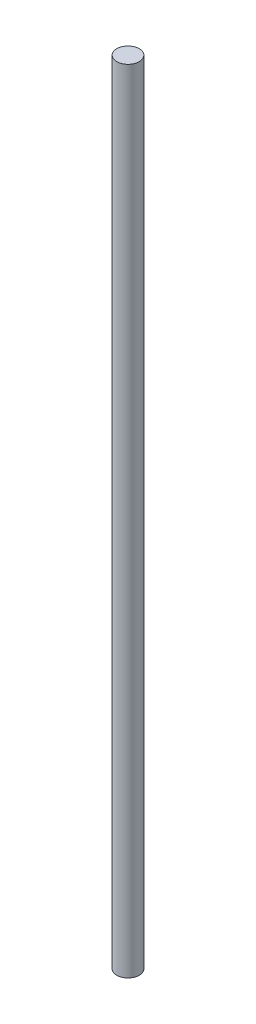
ISO-10303-21;
HEADER;
FILE_DESCRIPTION(('STEP AP214'),'2;1');
FILE_NAME('part.step','',(''),(''),'','','');
FILE_SCHEMA(('AUTOMOTIVE_DESIGN { 1 0 10303 214 1 1 1 1 }'));
ENDSEC;
DATA;
#1=APPLICATION_CONTEXT('core data for automotive mechanical design processes');
#2=APPLICATION_PROTOCOL_DEFINITION('international standard','automotive_design',2000,#1);
#3=PRODUCT_CONTEXT('',#1,'mechanical');
#4=PRODUCT('Part','Part','',(#3));
#5=PRODUCT_RELATED_PRODUCT_CATEGORY('part','',(#4));
#6=PRODUCT_DEFINITION_FORMATION('','',#4);
#7=PRODUCT_DEFINITION_CONTEXT('part definition',#1,'design');
#8=PRODUCT_DEFINITION('design','',#6,#7);
#9=PRODUCT_DEFINITION_SHAPE('','',#8);
#10=(LENGTH_UNIT() NAMED_UNIT(*) SI_UNIT(.MILLI.,.METRE.));
#11=(NAMED_UNIT(*) PLANE_ANGLE_UNIT() SI_UNIT($,.RADIAN.));
#12=(NAMED_UNIT(*) SI_UNIT($,.STERADIAN.) SOLID_ANGLE_UNIT());
#13=UNCERTAINTY_MEASURE_WITH_UNIT(LENGTH_MEASURE(1.E-05),#10,'distance_accuracy_value','');
#14=(GEOMETRIC_REPRESENTATION_CONTEXT(3) GLOBAL_UNCERTAINTY_ASSIGNED_CONTEXT((#13)) GLOBAL_UNIT_ASSIGNED_CONTEXT((#10,
#11,#12)) REPRESENTATION_CONTEXT('',''));
#15=CARTESIAN_POINT('',(0.,0.,0.));
#16=DIRECTION('',(0.,0.,1.));
#17=DIRECTION('',(1.,0.,0.));
#18=AXIS2_PLACEMENT_3D('',#15,#16,#17);
#19=CARTESIAN_POINT('',(0.,423.,0.));
#20=DIRECTION('',(0.,-1.,0.));
#21=DIRECTION('',(0.,0.,-1.));
#22=AXIS2_PLACEMENT_3D('',#19,#20,#21);
#23=CYLINDRICAL_SURFACE('',#22,6.);
#24=CARTESIAN_POINT('',(0.,423.,0.));
#25=DIRECTION('',(0.,1.,0.));
#26=DIRECTION('',(0.,0.,1.));
#27=AXIS2_PLACEMENT_3D('',#24,#25,#26);
#28=CIRCLE('',#27,6.);
#29=CARTESIAN_POINT('',(0.,423.,-6.));
#30=VERTEX_POINT('',#29);
#31=EDGE_CURVE('E10',#30,#30,#28,.T.);
#32=CARTESIAN_POINT('',(0.,0.,0.));
#33=DIRECTION('',(0.,1.,0.));
#34=DIRECTION('',(0.,0.,1.));
#35=AXIS2_PLACEMENT_3D('',#32,#33,#34);
#36=CIRCLE('',#35,6.);
#37=CARTESIAN_POINT('',(0.,0.,-6.));
#38=VERTEX_POINT('',#37);
#39=EDGE_CURVE('E34',#38,#38,#36,.T.);
#40=CARTESIAN_POINT('',(0.,423.,-6.));
#41=CARTESIAN_POINT('',(0.,418.59375,-6.));
#42=CARTESIAN_POINT('',(0.,414.1875,-6.));
#43=CARTESIAN_POINT('',(0.,405.375,-6.));
#44=CARTESIAN_POINT('',(0.,400.96875,-6.));
#45=CARTESIAN_POINT('',(0.,392.15625,-6.));
#46=CARTESIAN_POINT('',(0.,387.75,-6.));
#47=CARTESIAN_POINT('',(0.,378.9375,-6.));
#48=CARTESIAN_POINT('',(0.,374.53125,-6.));
#49=CARTESIAN_POINT('',(0.,365.71875,-6.));
#50=CARTESIAN_POINT('',(0.,361.3125,-6.));
#51=CARTESIAN_POINT('',(0.,352.5,-6.));
#52=CARTESIAN_POINT('',(0.,348.09375,-6.));
#53=CARTESIAN_POINT('',(0.,339.28125,-6.));
#54=CARTESIAN_POINT('',(0.,334.875,-6.));
#55=CARTESIAN_POINT('',(0.,326.0625,-6.));
#56=CARTESIAN_POINT('',(0.,321.65625,-6.));
#57=CARTESIAN_POINT('',(0.,312.84375,-6.));
#58=CARTESIAN_POINT('',(0.,308.4375,-6.));
#59=CARTESIAN_POINT('',(0.,299.625,-6.));
#60=CARTESIAN_POINT('',(0.,295.21875,-6.));
#61=CARTESIAN_POINT('',(0.,286.40625,-6.));
#62=CARTESIAN_POINT('',(0.,282.,-6.));
#63=CARTESIAN_POINT('',(0.,273.1875,-6.));
#64=CARTESIAN_POINT('',(0.,268.78125,-6.));
#65=CARTESIAN_POINT('',(0.,259.96875,-6.));
#66=CARTESIAN_POINT('',(0.,255.5625,-6.));
#67=CARTESIAN_POINT('',(0.,246.75,-6.));
#68=CARTESIAN_POINT('',(0.,242.34375,-6.));
#69=CARTESIAN_POINT('',(0.,233.53125,-6.));
#70=CARTESIAN_POINT('',(0.,229.125,-6.));
#71=CARTESIAN_POINT('',(0.,220.3125,-6.));
#72=CARTESIAN_POINT('',(0.,215.90625,-6.));
#73=CARTESIAN_POINT('',(0.,207.09375,-6.));
#74=CARTESIAN_POINT('',(0.,202.6875,-6.));
#75=CARTESIAN_POINT('',(0.,193.875,-6.));
#76=CARTESIAN_POINT('',(0.,189.46875,-6.));
#77=CARTESIAN_POINT('',(0.,180.65625,-6.));
#78=CARTESIAN_POINT('',(0.,176.25,-6.));
#79=CARTESIAN_POINT('',(0.,167.4375,-6.));
#80=CARTESIAN_POINT('',(0.,163.03125,-6.));
#81=CARTESIAN_POINT('',(0.,154.21875,-6.));
#82=CARTESIAN_POINT('',(0.,149.8125,-6.));
#83=CARTESIAN_POINT('',(0.,141.,-6.));
#84=CARTESIAN_POINT('',(0.,136.59375,-6.));
#85=CARTESIAN_POINT('',(0.,127.78125,-6.));
#86=CARTESIAN_POINT('',(0.,123.375,-6.));
#87=CARTESIAN_POINT('',(0.,114.5625,-6.));
#88=CARTESIAN_POINT('',(0.,110.15625,-6.));
#89=CARTESIAN_POINT('',(0.,101.34375,-6.));
#90=CARTESIAN_POINT('',(0.,96.9375,-6.));
#91=CARTESIAN_POINT('',(0.,88.125,-6.));
#92=CARTESIAN_POINT('',(0.,83.71875,-6.));
#93=CARTESIAN_POINT('',(0.,74.90625,-6.));
#94=CARTESIAN_POINT('',(0.,70.5,-6.));
#95=CARTESIAN_POINT('',(0.,61.6875,-6.));
#96=CARTESIAN_POINT('',(0.,57.28125,-6.));
#97=CARTESIAN_POINT('',(0.,48.46875,-6.));
#98=CARTESIAN_POINT('',(0.,44.0625,-6.));
#99=CARTESIAN_POINT('',(0.,35.25,-6.));
#100=CARTESIAN_POINT('',(0.,30.84375,-6.));
#101=CARTESIAN_POINT('',(0.,22.03125,-6.));
#102=CARTESIAN_POINT('',(0.,17.625,-6.));
#103=CARTESIAN_POINT('',(0.,8.8125,-6.));
#104=CARTESIAN_POINT('',(0.,4.40625,-6.));
#105=CARTESIAN_POINT('',(0.,0.,-6.));
#106=B_SPLINE_CURVE_WITH_KNOTS('',3,(#40,#41,#42,#43,#44,#45,#46,#47,#48,#49,#50,#51,#52,#53,
#54,#55,#56,#57,#58,#59,#60,#61,#62,#63,#64,#65,#66,#67,#68,#69,#70,#71,#72,#73,#74,#75,#76,#77,
#78,#79,#80,#81,#82,#83,#84,#85,#86,#87,#88,#89,#90,#91,#92,#93,#94,#95,#96,#97,#98,#99,#100,
#101,#102,#103,#104,#105),.UNSPECIFIED.,.F.,.F.,(4,2,2,2,2,2,2,2,2,2,2,2,2,2,2,2,2,2,2,2,2,2,2,
2,2,2,2,2,2,2,2,2,4),(0.,13.21875,26.4375,39.65625,52.875,66.09375,79.3125,92.53125,105.75,
118.96875,132.1875,145.40625,158.625,171.84375,185.0625,198.28125,211.5,224.71875,237.9375,
251.15625,264.375,277.59375,290.8125,304.03125,317.25,330.46875,343.6875,356.90625,370.125,
383.34375,396.5625,409.78125,423.),.UNSPECIFIED.);
#107=EDGE_CURVE('BSEAM31',#30,#38,#106,.T.);
#108=ORIENTED_EDGE('',*,*,#31,.F.);
#109=ORIENTED_EDGE('',*,*,#39,.T.);
#110=ORIENTED_EDGE('',*,*,#107,.T.);
#111=ORIENTED_EDGE('',*,*,#107,.F.);
#112=EDGE_LOOP('',(#108,#110,#109,#111));
#113=FACE_BOUND('',#112,.T.);
#114=ADVANCED_FACE('F31',(#113),#23,.T.);
#115=CARTESIAN_POINT('',(0.,423.,0.));
#116=DIRECTION('',(0.,1.,0.));
#117=DIRECTION('',(0.,0.,1.));
#118=AXIS2_PLACEMENT_3D('',#115,#116,#117);
#119=PLANE('',#118);
#120=ORIENTED_EDGE('',*,*,#31,.T.);
#121=EDGE_LOOP('',(#120));
#122=FACE_BOUND('',#121,.T.);
#123=ADVANCED_FACE('F46',(#122),#119,.T.);
#124=CARTESIAN_POINT('',(0.,0.,0.));
#125=DIRECTION('',(0.,1.,0.));
#126=DIRECTION('',(0.,0.,1.));
#127=AXIS2_PLACEMENT_3D('',#124,#125,#126);
#128=PLANE('',#127);
#129=ORIENTED_EDGE('',*,*,#39,.F.);
#130=EDGE_LOOP('',(#129));
#131=FACE_BOUND('',#130,.T.);
#132=ADVANCED_FACE('F44',(#131),#128,.F.);
#133=CLOSED_SHELL('',(#114,#123,#132));
#134=MANIFOLD_SOLID_BREP('B2',#133);
#135=ADVANCED_BREP_SHAPE_REPRESENTATION('',(#18,#134),#14);
#136=SHAPE_DEFINITION_REPRESENTATION(#9,#135);
ENDSEC;
END-ISO-10303-21;
